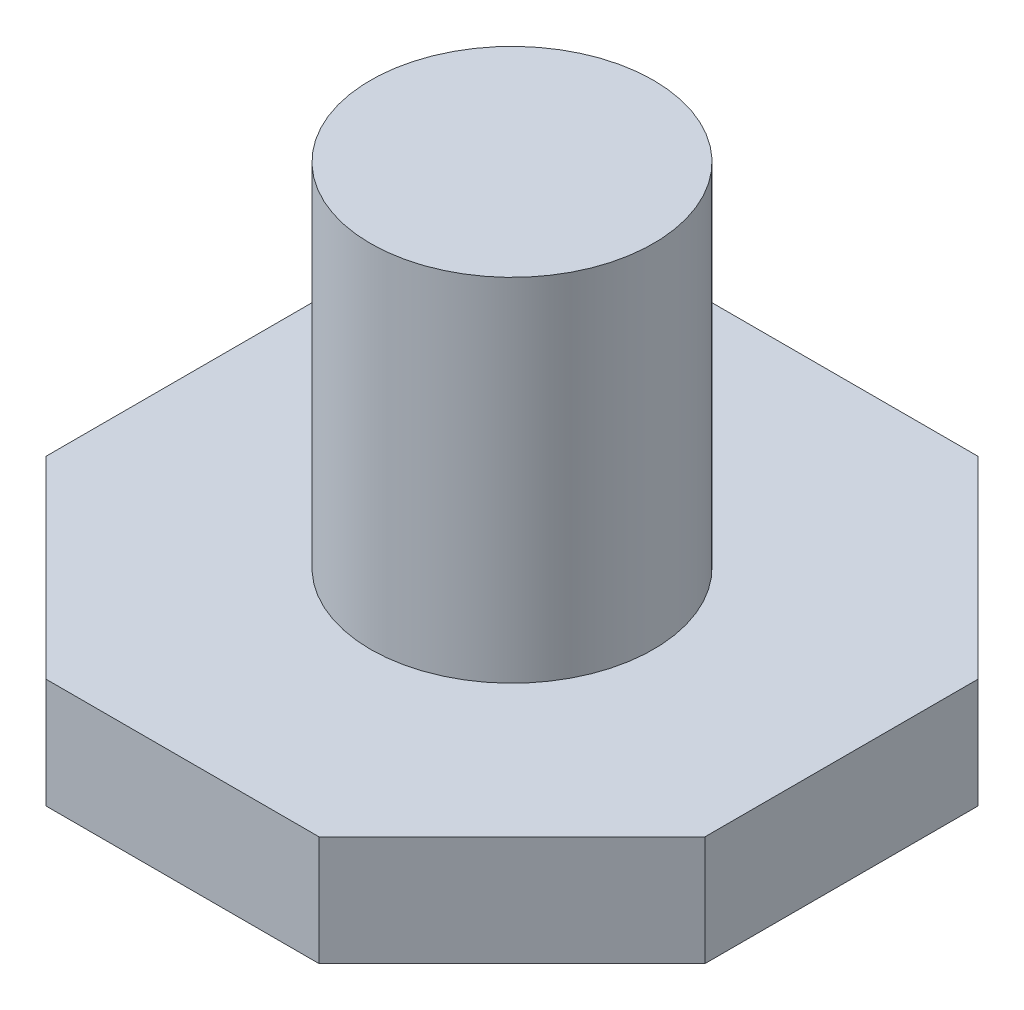
ISO-10303-21;
HEADER;
FILE_DESCRIPTION(('STEP AP214'),'2;1');
FILE_NAME('part.step','',(''),(''),'','','');
FILE_SCHEMA(('AUTOMOTIVE_DESIGN { 1 0 10303 214 1 1 1 1 }'));
ENDSEC;
DATA;
#1=APPLICATION_CONTEXT('core data for automotive mechanical design processes');
#2=APPLICATION_PROTOCOL_DEFINITION('international standard','automotive_design',2000,#1);
#3=PRODUCT_CONTEXT('',#1,'mechanical');
#4=PRODUCT('Part','Part','',(#3));
#5=PRODUCT_RELATED_PRODUCT_CATEGORY('part','',(#4));
#6=PRODUCT_DEFINITION_FORMATION('','',#4);
#7=PRODUCT_DEFINITION_CONTEXT('part definition',#1,'design');
#8=PRODUCT_DEFINITION('design','',#6,#7);
#9=PRODUCT_DEFINITION_SHAPE('','',#8);
#10=(LENGTH_UNIT() NAMED_UNIT(*) SI_UNIT(.MILLI.,.METRE.));
#11=(NAMED_UNIT(*) PLANE_ANGLE_UNIT() SI_UNIT($,.RADIAN.));
#12=(NAMED_UNIT(*) SI_UNIT($,.STERADIAN.) SOLID_ANGLE_UNIT());
#13=UNCERTAINTY_MEASURE_WITH_UNIT(LENGTH_MEASURE(1.E-05),#10,'distance_accuracy_value','');
#14=(GEOMETRIC_REPRESENTATION_CONTEXT(3) GLOBAL_UNCERTAINTY_ASSIGNED_CONTEXT((#13)) GLOBAL_UNIT_ASSIGNED_CONTEXT((#10,
#11,#12)) REPRESENTATION_CONTEXT('',''));
#15=CARTESIAN_POINT('',(0.,0.,0.));
#16=DIRECTION('',(0.,0.,1.));
#17=DIRECTION('',(1.,0.,0.));
#18=AXIS2_PLACEMENT_3D('',#15,#16,#17);
#19=CARTESIAN_POINT('',(0.,1.5875,0.));
#20=DIRECTION('',(0.,1.,0.));
#21=DIRECTION('',(0.,0.,1.));
#22=AXIS2_PLACEMENT_3D('',#19,#20,#21);
#23=PLANE('',#22);
#24=DIRECTION('',(0.707106781186547,0.,-0.707106781186548));
#25=VECTOR('',#24,1.);
#26=CARTESIAN_POINT('',(1.97269209080187,1.5875,4.7625));
#27=LINE('',#26,#25);
#28=CARTESIAN_POINT('',(1.97269209080187,1.5875,4.7625));
#29=VERTEX_POINT('',#28);
#30=CARTESIAN_POINT('',(4.7625,1.5875,1.97269209080187));
#31=VERTEX_POINT('',#30);
#32=EDGE_CURVE('E144',#29,#31,#27,.T.);
#33=ORIENTED_EDGE('',*,*,#32,.T.);
#34=DIRECTION('',(0.,0.,-1.));
#35=VECTOR('',#34,1.);
#36=CARTESIAN_POINT('',(4.7625,1.5875,1.97269209080187));
#37=LINE('',#36,#35);
#38=CARTESIAN_POINT('',(4.7625,1.5875,-1.97269209080187));
#39=VERTEX_POINT('',#38);
#40=EDGE_CURVE('E92',#31,#39,#37,.T.);
#41=ORIENTED_EDGE('',*,*,#40,.T.);
#42=DIRECTION('',(-0.707106781186548,0.,-0.707106781186547));
#43=VECTOR('',#42,1.);
#44=CARTESIAN_POINT('',(4.7625,1.5875,-1.97269209080187));
#45=LINE('',#44,#43);
#46=CARTESIAN_POINT('',(1.97269209080186,1.5875,-4.7625));
#47=VERTEX_POINT('',#46);
#48=EDGE_CURVE('E159',#39,#47,#45,.T.);
#49=ORIENTED_EDGE('',*,*,#48,.T.);
#50=DIRECTION('',(-1.,0.,0.));
#51=VECTOR('',#50,1.);
#52=CARTESIAN_POINT('',(1.97269209080186,1.5875,-4.7625));
#53=LINE('',#52,#51);
#54=CARTESIAN_POINT('',(-1.97269209080187,1.5875,-4.7625));
#55=VERTEX_POINT('',#54);
#56=EDGE_CURVE('E171',#47,#55,#53,.T.);
#57=ORIENTED_EDGE('',*,*,#56,.T.);
#58=DIRECTION('',(-0.707106781186547,0.,0.707106781186548));
#59=VECTOR('',#58,1.);
#60=CARTESIAN_POINT('',(-1.97269209080187,1.5875,-4.7625));
#61=LINE('',#60,#59);
#62=CARTESIAN_POINT('',(-4.7625,1.5875,-1.97269209080187));
#63=VERTEX_POINT('',#62);
#64=EDGE_CURVE('E111',#55,#63,#61,.T.);
#65=ORIENTED_EDGE('',*,*,#64,.T.);
#66=DIRECTION('',(0.,0.,1.));
#67=VECTOR('',#66,1.);
#68=CARTESIAN_POINT('',(-4.7625,1.5875,-1.97269209080187));
#69=LINE('',#68,#67);
#70=CARTESIAN_POINT('',(-4.7625,1.5875,1.97269209080187));
#71=VERTEX_POINT('',#70);
#72=EDGE_CURVE('E105',#63,#71,#69,.T.);
#73=ORIENTED_EDGE('',*,*,#72,.T.);
#74=DIRECTION('',(0.707106781186548,0.,0.707106781186547));
#75=VECTOR('',#74,1.);
#76=CARTESIAN_POINT('',(-4.7625,1.5875,1.97269209080187));
#77=LINE('',#76,#75);
#78=CARTESIAN_POINT('',(-1.97269209080186,1.5875,4.7625));
#79=VERTEX_POINT('',#78);
#80=EDGE_CURVE('E109',#71,#79,#77,.T.);
#81=ORIENTED_EDGE('',*,*,#80,.T.);
#82=DIRECTION('',(1.,0.,0.));
#83=VECTOR('',#82,1.);
#84=CARTESIAN_POINT('',(-1.97269209080186,1.5875,4.7625));
#85=LINE('',#84,#83);
#86=EDGE_CURVE('E49',#79,#29,#85,.T.);
#87=ORIENTED_EDGE('',*,*,#86,.T.);
#88=EDGE_LOOP('',(#33,#41,#49,#57,#65,#73,#81,#87));
#89=FACE_BOUND('',#88,.T.);
#90=CARTESIAN_POINT('',(0.,1.5875,0.));
#91=DIRECTION('',(0.,1.,0.));
#92=DIRECTION('',(0.,0.,1.));
#93=AXIS2_PLACEMENT_3D('',#90,#91,#92);
#94=CIRCLE('',#93,2.0447);
#95=CARTESIAN_POINT('',(0.,1.5875,2.0447));
#96=VERTEX_POINT('',#95);
#97=EDGE_CURVE('E177',#96,#96,#94,.T.);
#98=ORIENTED_EDGE('',*,*,#97,.F.);
#99=EDGE_LOOP('',(#98));
#100=FACE_BOUND('',#99,.T.);
#101=ADVANCED_FACE('F32',(#89,#100),#23,.T.);
#102=CARTESIAN_POINT('',(1.97269209080187,1.5875,4.7625));
#103=DIRECTION('',(-0.707106781186548,0.,-0.707106781186547));
#104=DIRECTION('',(-0.707106781186547,0.,0.707106781186548));
#105=AXIS2_PLACEMENT_3D('',#102,#103,#104);
#106=PLANE('',#105);
#107=DIRECTION('',(0.707106781186547,0.,-0.707106781186548));
#108=VECTOR('',#107,1.);
#109=CARTESIAN_POINT('',(1.97269209080187,0.,4.7625));
#110=LINE('',#109,#108);
#111=CARTESIAN_POINT('',(1.97269209080187,0.,4.7625));
#112=VERTEX_POINT('',#111);
#113=CARTESIAN_POINT('',(4.7625,0.,1.97269209080187));
#114=VERTEX_POINT('',#113);
#115=EDGE_CURVE('E129',#112,#114,#110,.T.);
#116=ORIENTED_EDGE('',*,*,#115,.T.);
#117=DIRECTION('',(0.,-1.,0.));
#118=VECTOR('',#117,1.);
#119=CARTESIAN_POINT('',(4.7625,1.5875,1.97269209080187));
#120=LINE('',#119,#118);
#121=EDGE_CURVE('E11',#31,#114,#120,.T.);
#122=ORIENTED_EDGE('',*,*,#121,.F.);
#123=ORIENTED_EDGE('',*,*,#32,.F.);
#124=DIRECTION('',(0.,-1.,0.));
#125=VECTOR('',#124,1.);
#126=CARTESIAN_POINT('',(1.97269209080187,1.5875,4.7625));
#127=LINE('',#126,#125);
#128=EDGE_CURVE('E125',#29,#112,#127,.T.);
#129=ORIENTED_EDGE('',*,*,#128,.T.);
#130=EDGE_LOOP('',(#116,#122,#123,#129));
#131=FACE_BOUND('',#130,.T.);
#132=ADVANCED_FACE('F34',(#131),#106,.F.);
#133=CARTESIAN_POINT('',(4.7625,1.5875,1.97269209080187));
#134=DIRECTION('',(-1.,0.,0.));
#135=DIRECTION('',(0.,0.,1.));
#136=AXIS2_PLACEMENT_3D('',#133,#134,#135);
#137=PLANE('',#136);
#138=DIRECTION('',(0.,0.,-1.));
#139=VECTOR('',#138,1.);
#140=CARTESIAN_POINT('',(4.7625,0.,1.97269209080187));
#141=LINE('',#140,#139);
#142=CARTESIAN_POINT('',(4.7625,0.,-1.97269209080187));
#143=VERTEX_POINT('',#142);
#144=EDGE_CURVE('E132',#114,#143,#141,.T.);
#145=ORIENTED_EDGE('',*,*,#144,.T.);
#146=DIRECTION('',(0.,-1.,0.));
#147=VECTOR('',#146,1.);
#148=CARTESIAN_POINT('',(4.7625,1.5875,-1.97269209080187));
#149=LINE('',#148,#147);
#150=EDGE_CURVE('E41',#39,#143,#149,.T.);
#151=ORIENTED_EDGE('',*,*,#150,.F.);
#152=ORIENTED_EDGE('',*,*,#40,.F.);
#153=ORIENTED_EDGE('',*,*,#121,.T.);
#154=EDGE_LOOP('',(#145,#151,#152,#153));
#155=FACE_BOUND('',#154,.T.);
#156=ADVANCED_FACE('F195',(#155),#137,.F.);
#157=CARTESIAN_POINT('',(4.7625,1.5875,-1.97269209080187));
#158=DIRECTION('',(-0.707106781186547,0.,0.707106781186548));
#159=DIRECTION('',(0.707106781186548,0.,0.707106781186547));
#160=AXIS2_PLACEMENT_3D('',#157,#158,#159);
#161=PLANE('',#160);
#162=DIRECTION('',(-0.707106781186548,0.,-0.707106781186547));
#163=VECTOR('',#162,1.);
#164=CARTESIAN_POINT('',(4.7625,0.,-1.97269209080187));
#165=LINE('',#164,#163);
#166=CARTESIAN_POINT('',(1.97269209080186,0.,-4.7625));
#167=VERTEX_POINT('',#166);
#168=EDGE_CURVE('E135',#143,#167,#165,.T.);
#169=ORIENTED_EDGE('',*,*,#168,.T.);
#170=DIRECTION('',(0.,-1.,0.));
#171=VECTOR('',#170,1.);
#172=CARTESIAN_POINT('',(1.97269209080186,1.5875,-4.7625));
#173=LINE('',#172,#171);
#174=EDGE_CURVE('E151',#47,#167,#173,.T.);
#175=ORIENTED_EDGE('',*,*,#174,.F.);
#176=ORIENTED_EDGE('',*,*,#48,.F.);
#177=ORIENTED_EDGE('',*,*,#150,.T.);
#178=EDGE_LOOP('',(#169,#175,#176,#177));
#179=FACE_BOUND('',#178,.T.);
#180=ADVANCED_FACE('F157',(#179),#161,.F.);
#181=CARTESIAN_POINT('',(1.97269209080186,1.5875,-4.7625));
#182=DIRECTION('',(0.,0.,1.));
#183=DIRECTION('',(1.,0.,0.));
#184=AXIS2_PLACEMENT_3D('',#181,#182,#183);
#185=PLANE('',#184);
#186=DIRECTION('',(-1.,0.,0.));
#187=VECTOR('',#186,1.);
#188=CARTESIAN_POINT('',(1.97269209080186,0.,-4.7625));
#189=LINE('',#188,#187);
#190=CARTESIAN_POINT('',(-1.97269209080187,0.,-4.7625));
#191=VERTEX_POINT('',#190);
#192=EDGE_CURVE('E137',#167,#191,#189,.T.);
#193=ORIENTED_EDGE('',*,*,#192,.T.);
#194=DIRECTION('',(0.,-1.,0.));
#195=VECTOR('',#194,1.);
#196=CARTESIAN_POINT('',(-1.97269209080187,1.5875,-4.7625));
#197=LINE('',#196,#195);
#198=EDGE_CURVE('E148',#55,#191,#197,.T.);
#199=ORIENTED_EDGE('',*,*,#198,.F.);
#200=ORIENTED_EDGE('',*,*,#56,.F.);
#201=ORIENTED_EDGE('',*,*,#174,.T.);
#202=EDGE_LOOP('',(#193,#199,#200,#201));
#203=FACE_BOUND('',#202,.T.);
#204=ADVANCED_FACE('F167',(#203),#185,.F.);
#205=CARTESIAN_POINT('',(-1.97269209080187,1.5875,-4.7625));
#206=DIRECTION('',(0.707106781186548,0.,0.707106781186547));
#207=DIRECTION('',(0.707106781186547,0.,-0.707106781186548));
#208=AXIS2_PLACEMENT_3D('',#205,#206,#207);
#209=PLANE('',#208);
#210=DIRECTION('',(-0.707106781186547,0.,0.707106781186548));
#211=VECTOR('',#210,1.);
#212=CARTESIAN_POINT('',(-1.97269209080187,0.,-4.7625));
#213=LINE('',#212,#211);
#214=CARTESIAN_POINT('',(-4.7625,0.,-1.97269209080187));
#215=VERTEX_POINT('',#214);
#216=EDGE_CURVE('E139',#191,#215,#213,.T.);
#217=ORIENTED_EDGE('',*,*,#216,.T.);
#218=DIRECTION('',(0.,-1.,0.));
#219=VECTOR('',#218,1.);
#220=CARTESIAN_POINT('',(-4.7625,1.5875,-1.97269209080187));
#221=LINE('',#220,#219);
#222=EDGE_CURVE('E120',#63,#215,#221,.T.);
#223=ORIENTED_EDGE('',*,*,#222,.F.);
#224=ORIENTED_EDGE('',*,*,#64,.F.);
#225=ORIENTED_EDGE('',*,*,#198,.T.);
#226=EDGE_LOOP('',(#217,#223,#224,#225));
#227=FACE_BOUND('',#226,.T.);
#228=ADVANCED_FACE('F170',(#227),#209,.F.);
#229=CARTESIAN_POINT('',(-4.7625,1.5875,-1.97269209080187));
#230=DIRECTION('',(1.,0.,0.));
#231=DIRECTION('',(0.,0.,-1.));
#232=AXIS2_PLACEMENT_3D('',#229,#230,#231);
#233=PLANE('',#232);
#234=DIRECTION('',(0.,0.,1.));
#235=VECTOR('',#234,1.);
#236=CARTESIAN_POINT('',(-4.7625,0.,-1.97269209080187));
#237=LINE('',#236,#235);
#238=CARTESIAN_POINT('',(-4.7625,0.,1.97269209080187));
#239=VERTEX_POINT('',#238);
#240=EDGE_CURVE('E119',#215,#239,#237,.T.);
#241=ORIENTED_EDGE('',*,*,#240,.T.);
#242=DIRECTION('',(0.,-1.,0.));
#243=VECTOR('',#242,1.);
#244=CARTESIAN_POINT('',(-4.7625,1.5875,1.97269209080187));
#245=LINE('',#244,#243);
#246=EDGE_CURVE('E116',#71,#239,#245,.T.);
#247=ORIENTED_EDGE('',*,*,#246,.F.);
#248=ORIENTED_EDGE('',*,*,#72,.F.);
#249=ORIENTED_EDGE('',*,*,#222,.T.);
#250=EDGE_LOOP('',(#241,#247,#248,#249));
#251=FACE_BOUND('',#250,.T.);
#252=ADVANCED_FACE('F117',(#251),#233,.F.);
#253=CARTESIAN_POINT('',(-4.7625,1.5875,1.97269209080187));
#254=DIRECTION('',(0.707106781186547,0.,-0.707106781186548));
#255=DIRECTION('',(-0.707106781186548,0.,-0.707106781186547));
#256=AXIS2_PLACEMENT_3D('',#253,#254,#255);
#257=PLANE('',#256);
#258=DIRECTION('',(0.707106781186548,0.,0.707106781186547));
#259=VECTOR('',#258,1.);
#260=CARTESIAN_POINT('',(-4.7625,0.,1.97269209080187));
#261=LINE('',#260,#259);
#262=CARTESIAN_POINT('',(-1.97269209080186,0.,4.7625));
#263=VERTEX_POINT('',#262);
#264=EDGE_CURVE('E78',#239,#263,#261,.T.);
#265=ORIENTED_EDGE('',*,*,#264,.T.);
#266=DIRECTION('',(0.,-1.,0.));
#267=VECTOR('',#266,1.);
#268=CARTESIAN_POINT('',(-1.97269209080186,1.5875,4.7625));
#269=LINE('',#268,#267);
#270=EDGE_CURVE('E121',#79,#263,#269,.T.);
#271=ORIENTED_EDGE('',*,*,#270,.F.);
#272=ORIENTED_EDGE('',*,*,#80,.F.);
#273=ORIENTED_EDGE('',*,*,#246,.T.);
#274=EDGE_LOOP('',(#265,#271,#272,#273));
#275=FACE_BOUND('',#274,.T.);
#276=ADVANCED_FACE('F123',(#275),#257,.F.);
#277=CARTESIAN_POINT('',(-1.97269209080186,1.5875,4.7625));
#278=DIRECTION('',(0.,0.,-1.));
#279=DIRECTION('',(-1.,0.,0.));
#280=AXIS2_PLACEMENT_3D('',#277,#278,#279);
#281=PLANE('',#280);
#282=DIRECTION('',(1.,0.,0.));
#283=VECTOR('',#282,1.);
#284=CARTESIAN_POINT('',(-1.97269209080186,0.,4.7625));
#285=LINE('',#284,#283);
#286=EDGE_CURVE('E84',#263,#112,#285,.T.);
#287=ORIENTED_EDGE('',*,*,#286,.T.);
#288=ORIENTED_EDGE('',*,*,#128,.F.);
#289=ORIENTED_EDGE('',*,*,#86,.F.);
#290=ORIENTED_EDGE('',*,*,#270,.T.);
#291=EDGE_LOOP('',(#287,#288,#289,#290));
#292=FACE_BOUND('',#291,.T.);
#293=ADVANCED_FACE('F201',(#292),#281,.F.);
#294=CARTESIAN_POINT('',(0.,0.,0.));
#295=DIRECTION('',(0.,1.,0.));
#296=DIRECTION('',(0.,0.,1.));
#297=AXIS2_PLACEMENT_3D('',#294,#295,#296);
#298=PLANE('',#297);
#299=ORIENTED_EDGE('',*,*,#115,.F.);
#300=ORIENTED_EDGE('',*,*,#286,.F.);
#301=ORIENTED_EDGE('',*,*,#264,.F.);
#302=ORIENTED_EDGE('',*,*,#240,.F.);
#303=ORIENTED_EDGE('',*,*,#216,.F.);
#304=ORIENTED_EDGE('',*,*,#192,.F.);
#305=ORIENTED_EDGE('',*,*,#168,.F.);
#306=ORIENTED_EDGE('',*,*,#144,.F.);
#307=EDGE_LOOP('',(#299,#300,#301,#302,#303,#304,#305,#306));
#308=FACE_BOUND('',#307,.T.);
#309=ADVANCED_FACE('F163',(#308),#298,.F.);
#310=CARTESIAN_POINT('',(0.,6.6675,0.));
#311=DIRECTION('',(0.,-1.,0.));
#312=DIRECTION('',(0.,0.,-1.));
#313=AXIS2_PLACEMENT_3D('',#310,#311,#312);
#314=CYLINDRICAL_SURFACE('',#313,2.0447);
#315=CARTESIAN_POINT('',(0.,6.6675,0.));
#316=DIRECTION('',(0.,1.,0.));
#317=DIRECTION('',(0.,0.,1.));
#318=AXIS2_PLACEMENT_3D('',#315,#316,#317);
#319=CIRCLE('',#318,2.0447);
#320=CARTESIAN_POINT('',(0.,6.6675,2.0447));
#321=VERTEX_POINT('',#320);
#322=EDGE_CURVE('E133',#321,#321,#319,.T.);
#323=ORIENTED_EDGE('',*,*,#322,.F.);
#324=EDGE_LOOP('',(#323));
#325=FACE_BOUND('',#324,.T.);
#326=ORIENTED_EDGE('',*,*,#97,.T.);
#327=EDGE_LOOP('',(#326));
#328=FACE_BOUND('',#327,.T.);
#329=ADVANCED_FACE('F185',(#325,#328),#314,.T.);
#330=CARTESIAN_POINT('',(0.,6.6675,0.));
#331=DIRECTION('',(0.,1.,0.));
#332=DIRECTION('',(0.,0.,1.));
#333=AXIS2_PLACEMENT_3D('',#330,#331,#332);
#334=PLANE('',#333);
#335=ORIENTED_EDGE('',*,*,#322,.T.);
#336=EDGE_LOOP('',(#335));
#337=FACE_BOUND('',#336,.T.);
#338=ADVANCED_FACE('F183',(#337),#334,.T.);
#339=CLOSED_SHELL('',(#101,#132,#156,#180,#204,#228,#252,#276,#293,#309,#329,#338));
#340=MANIFOLD_SOLID_BREP('B2',#339);
#341=ADVANCED_BREP_SHAPE_REPRESENTATION('',(#18,#340),#14);
#342=SHAPE_DEFINITION_REPRESENTATION(#9,#341);
ENDSEC;
END-ISO-10303-21;
